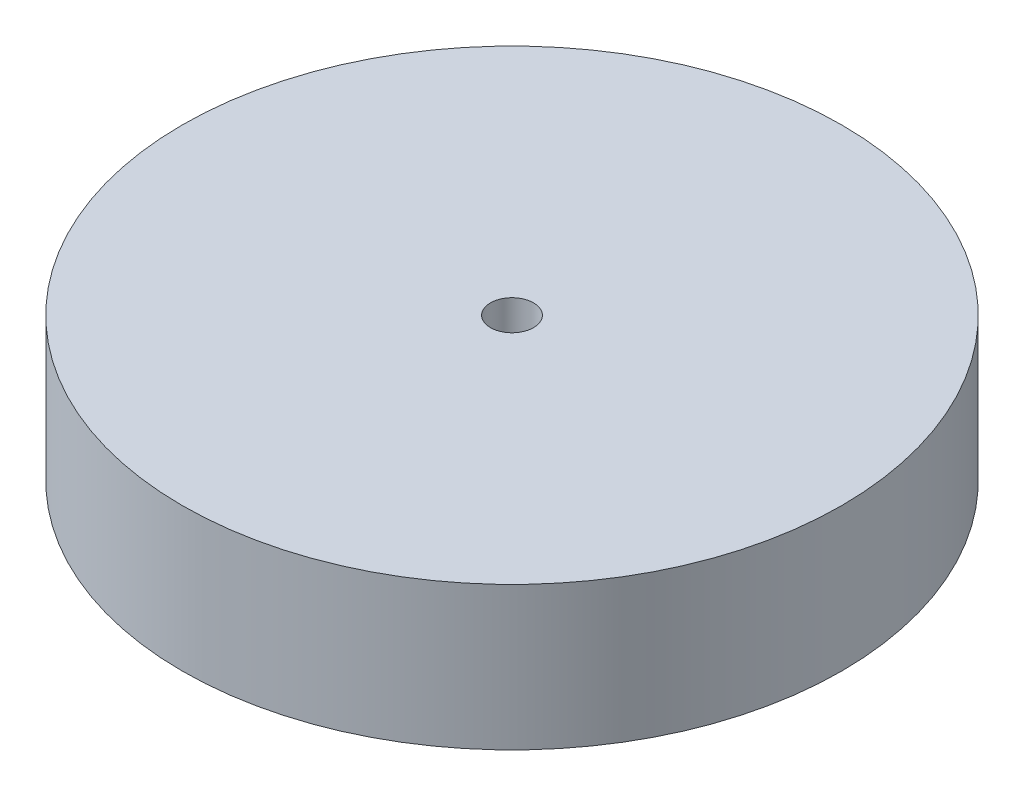
ISO-10303-21;
HEADER;
FILE_DESCRIPTION(('STEP AP214'),'2;1');
FILE_NAME('part.step','',(''),(''),'','','');
FILE_SCHEMA(('AUTOMOTIVE_DESIGN { 1 0 10303 214 1 1 1 1 }'));
ENDSEC;
DATA;
#1=APPLICATION_CONTEXT('core data for automotive mechanical design processes');
#2=APPLICATION_PROTOCOL_DEFINITION('international standard','automotive_design',2000,#1);
#3=PRODUCT_CONTEXT('',#1,'mechanical');
#4=PRODUCT('Part','Part','',(#3));
#5=PRODUCT_RELATED_PRODUCT_CATEGORY('part','',(#4));
#6=PRODUCT_DEFINITION_FORMATION('','',#4);
#7=PRODUCT_DEFINITION_CONTEXT('part definition',#1,'design');
#8=PRODUCT_DEFINITION('design','',#6,#7);
#9=PRODUCT_DEFINITION_SHAPE('','',#8);
#10=(LENGTH_UNIT() NAMED_UNIT(*) SI_UNIT(.MILLI.,.METRE.));
#11=(NAMED_UNIT(*) PLANE_ANGLE_UNIT() SI_UNIT($,.RADIAN.));
#12=(NAMED_UNIT(*) SI_UNIT($,.STERADIAN.) SOLID_ANGLE_UNIT());
#13=UNCERTAINTY_MEASURE_WITH_UNIT(LENGTH_MEASURE(1.E-05),#10,'distance_accuracy_value','');
#14=(GEOMETRIC_REPRESENTATION_CONTEXT(3) GLOBAL_UNCERTAINTY_ASSIGNED_CONTEXT((#13)) GLOBAL_UNIT_ASSIGNED_CONTEXT((#10,
#11,#12)) REPRESENTATION_CONTEXT('',''));
#15=CARTESIAN_POINT('',(0.,0.,0.));
#16=DIRECTION('',(0.,0.,1.));
#17=DIRECTION('',(1.,0.,0.));
#18=AXIS2_PLACEMENT_3D('',#15,#16,#17);
#19=CARTESIAN_POINT('',(0.,10.,0.));
#20=DIRECTION('',(0.,-1.,0.));
#21=DIRECTION('',(0.,0.,-1.));
#22=AXIS2_PLACEMENT_3D('',#19,#20,#21);
#23=CYLINDRICAL_SURFACE('',#22,23.);
#24=CARTESIAN_POINT('',(0.,10.,0.));
#25=DIRECTION('',(0.,1.,0.));
#26=DIRECTION('',(0.,0.,1.));
#27=AXIS2_PLACEMENT_3D('',#24,#25,#26);
#28=CIRCLE('',#27,23.);
#29=CARTESIAN_POINT('',(0.,10.,23.));
#30=VERTEX_POINT('',#29);
#31=EDGE_CURVE('E10',#30,#30,#28,.T.);
#32=ORIENTED_EDGE('',*,*,#31,.F.);
#33=EDGE_LOOP('',(#32));
#34=FACE_BOUND('',#33,.T.);
#35=CARTESIAN_POINT('',(0.,0.,0.));
#36=DIRECTION('',(0.,1.,0.));
#37=DIRECTION('',(0.,0.,1.));
#38=AXIS2_PLACEMENT_3D('',#35,#36,#37);
#39=CIRCLE('',#38,23.);
#40=CARTESIAN_POINT('',(0.,0.,23.));
#41=VERTEX_POINT('',#40);
#42=EDGE_CURVE('E42',#41,#41,#39,.T.);
#43=ORIENTED_EDGE('',*,*,#42,.T.);
#44=EDGE_LOOP('',(#43));
#45=FACE_BOUND('',#44,.T.);
#46=ADVANCED_FACE('F39',(#34,#45),#23,.T.);
#47=CARTESIAN_POINT('',(0.,10.,0.));
#48=DIRECTION('',(0.,1.,0.));
#49=DIRECTION('',(0.,0.,1.));
#50=AXIS2_PLACEMENT_3D('',#47,#48,#49);
#51=PLANE('',#50);
#52=CARTESIAN_POINT('',(0.,10.,0.));
#53=DIRECTION('',(0.,1.,0.));
#54=DIRECTION('',(0.,0.,1.));
#55=AXIS2_PLACEMENT_3D('',#52,#53,#54);
#56=CIRCLE('',#55,1.5);
#57=CARTESIAN_POINT('',(0.,10.,1.5));
#58=VERTEX_POINT('',#57);
#59=EDGE_CURVE('E60',#58,#58,#56,.F.);
#60=ORIENTED_EDGE('',*,*,#59,.T.);
#61=EDGE_LOOP('',(#60));
#62=FACE_BOUND('',#61,.T.);
#63=ORIENTED_EDGE('',*,*,#31,.T.);
#64=EDGE_LOOP('',(#63));
#65=FACE_BOUND('',#64,.T.);
#66=ADVANCED_FACE('F99',(#62,#65),#51,.T.);
#67=CARTESIAN_POINT('',(0.,0.,0.));
#68=DIRECTION('',(0.,1.,0.));
#69=DIRECTION('',(0.,0.,1.));
#70=AXIS2_PLACEMENT_3D('',#67,#68,#69);
#71=PLANE('',#70);
#72=CARTESIAN_POINT('',(0.,0.,0.));
#73=DIRECTION('',(0.,-1.,0.));
#74=DIRECTION('',(0.,0.,-1.));
#75=AXIS2_PLACEMENT_3D('',#72,#73,#74);
#76=CIRCLE('',#75,20.);
#77=CARTESIAN_POINT('',(0.,0.,-20.));
#78=VERTEX_POINT('',#77);
#79=EDGE_CURVE('E51',#78,#78,#76,.T.);
#80=ORIENTED_EDGE('',*,*,#79,.F.);
#81=EDGE_LOOP('',(#80));
#82=FACE_BOUND('',#81,.T.);
#83=ORIENTED_EDGE('',*,*,#42,.F.);
#84=EDGE_LOOP('',(#83));
#85=FACE_BOUND('',#84,.T.);
#86=ADVANCED_FACE('F93',(#82,#85),#71,.F.);
#87=CARTESIAN_POINT('',(0.,7.3,0.));
#88=DIRECTION('',(0.,-1.,0.));
#89=DIRECTION('',(0.,0.,-1.));
#90=AXIS2_PLACEMENT_3D('',#87,#88,#89);
#91=CYLINDRICAL_SURFACE('',#90,20.);
#92=CARTESIAN_POINT('',(0.,7.3,0.));
#93=DIRECTION('',(0.,-1.,0.));
#94=DIRECTION('',(0.,0.,-1.));
#95=AXIS2_PLACEMENT_3D('',#92,#93,#94);
#96=CIRCLE('',#95,20.);
#97=CARTESIAN_POINT('',(0.,7.3,-20.));
#98=VERTEX_POINT('',#97);
#99=EDGE_CURVE('E49',#98,#98,#96,.T.);
#100=ORIENTED_EDGE('',*,*,#99,.F.);
#101=EDGE_LOOP('',(#100));
#102=FACE_BOUND('',#101,.T.);
#103=ORIENTED_EDGE('',*,*,#79,.T.);
#104=EDGE_LOOP('',(#103));
#105=FACE_BOUND('',#104,.T.);
#106=ADVANCED_FACE('F87',(#102,#105),#91,.F.);
#107=CARTESIAN_POINT('',(0.,7.3,0.));
#108=DIRECTION('',(0.,-1.,0.));
#109=DIRECTION('',(0.,0.,-1.));
#110=AXIS2_PLACEMENT_3D('',#107,#108,#109);
#111=PLANE('',#110);
#112=CARTESIAN_POINT('',(0.,7.3,0.));
#113=DIRECTION('',(0.,-1.,0.));
#114=DIRECTION('',(0.,0.,-1.));
#115=AXIS2_PLACEMENT_3D('',#112,#113,#114);
#116=CIRCLE('',#115,6.);
#117=CARTESIAN_POINT('',(0.,7.3,6.));
#118=VERTEX_POINT('',#117);
#119=EDGE_CURVE('E57',#118,#118,#116,.T.);
#120=ORIENTED_EDGE('',*,*,#119,.F.);
#121=EDGE_LOOP('',(#120));
#122=FACE_BOUND('',#121,.T.);
#123=ORIENTED_EDGE('',*,*,#99,.T.);
#124=EDGE_LOOP('',(#123));
#125=FACE_BOUND('',#124,.T.);
#126=ADVANCED_FACE('F81',(#122,#125),#111,.T.);
#127=CARTESIAN_POINT('',(0.,-7.2,0.));
#128=DIRECTION('',(0.,1.,0.));
#129=DIRECTION('',(0.,0.,1.));
#130=AXIS2_PLACEMENT_3D('',#127,#128,#129);
#131=CYLINDRICAL_SURFACE('',#130,6.);
#132=CARTESIAN_POINT('',(0.,-7.2,0.));
#133=DIRECTION('',(0.,-1.,0.));
#134=DIRECTION('',(0.,0.,-1.));
#135=AXIS2_PLACEMENT_3D('',#132,#133,#134);
#136=CIRCLE('',#135,6.);
#137=CARTESIAN_POINT('',(0.,-7.2,6.));
#138=VERTEX_POINT('',#137);
#139=EDGE_CURVE('E54',#138,#138,#136,.T.);
#140=CARTESIAN_POINT('',(0.,-7.2,6.));
#141=CARTESIAN_POINT('',(0.,-7.04895833333333,6.));
#142=CARTESIAN_POINT('',(0.,-6.89791666666667,6.));
#143=CARTESIAN_POINT('',(0.,-6.59583333333333,6.));
#144=CARTESIAN_POINT('',(0.,-6.44479166666667,6.));
#145=CARTESIAN_POINT('',(0.,-6.14270833333333,6.));
#146=CARTESIAN_POINT('',(0.,-5.99166666666667,6.));
#147=CARTESIAN_POINT('',(0.,-5.68958333333333,6.));
#148=CARTESIAN_POINT('',(0.,-5.53854166666667,6.));
#149=CARTESIAN_POINT('',(0.,-5.23645833333333,6.));
#150=CARTESIAN_POINT('',(0.,-5.08541666666667,6.));
#151=CARTESIAN_POINT('',(0.,-4.78333333333333,6.));
#152=CARTESIAN_POINT('',(0.,-4.63229166666667,6.));
#153=CARTESIAN_POINT('',(0.,-4.33020833333333,6.));
#154=CARTESIAN_POINT('',(0.,-4.17916666666667,6.));
#155=CARTESIAN_POINT('',(0.,-3.87708333333333,6.));
#156=CARTESIAN_POINT('',(0.,-3.72604166666667,6.));
#157=CARTESIAN_POINT('',(0.,-3.42395833333333,6.));
#158=CARTESIAN_POINT('',(0.,-3.27291666666667,6.));
#159=CARTESIAN_POINT('',(0.,-2.97083333333333,6.));
#160=CARTESIAN_POINT('',(0.,-2.81979166666667,6.));
#161=CARTESIAN_POINT('',(0.,-2.51770833333333,6.));
#162=CARTESIAN_POINT('',(0.,-2.36666666666667,6.));
#163=CARTESIAN_POINT('',(0.,-2.06458333333333,6.));
#164=CARTESIAN_POINT('',(0.,-1.91354166666667,6.));
#165=CARTESIAN_POINT('',(0.,-1.61145833333333,6.));
#166=CARTESIAN_POINT('',(0.,-1.46041666666667,6.));
#167=CARTESIAN_POINT('',(0.,-1.15833333333333,6.));
#168=CARTESIAN_POINT('',(0.,-1.00729166666667,6.));
#169=CARTESIAN_POINT('',(0.,-0.705208333333333,6.));
#170=CARTESIAN_POINT('',(0.,-0.554166666666666,6.));
#171=CARTESIAN_POINT('',(0.,-0.252083333333333,6.));
#172=CARTESIAN_POINT('',(0.,-0.101041666666666,6.));
#173=CARTESIAN_POINT('',(0.,0.201041666666667,6.));
#174=CARTESIAN_POINT('',(0.,0.352083333333334,6.));
#175=CARTESIAN_POINT('',(0.,0.654166666666667,6.));
#176=CARTESIAN_POINT('',(0.,0.805208333333333,6.));
#177=CARTESIAN_POINT('',(0.,1.10729166666667,6.));
#178=CARTESIAN_POINT('',(0.,1.25833333333333,6.));
#179=CARTESIAN_POINT('',(0.,1.56041666666667,6.));
#180=CARTESIAN_POINT('',(0.,1.71145833333333,6.));
#181=CARTESIAN_POINT('',(0.,2.01354166666667,6.));
#182=CARTESIAN_POINT('',(0.,2.16458333333333,6.));
#183=CARTESIAN_POINT('',(0.,2.46666666666667,6.));
#184=CARTESIAN_POINT('',(0.,2.61770833333333,6.));
#185=CARTESIAN_POINT('',(0.,2.91979166666667,6.));
#186=CARTESIAN_POINT('',(0.,3.07083333333333,6.));
#187=CARTESIAN_POINT('',(0.,3.37291666666667,6.));
#188=CARTESIAN_POINT('',(0.,3.52395833333333,6.));
#189=CARTESIAN_POINT('',(0.,3.82604166666667,6.));
#190=CARTESIAN_POINT('',(0.,3.97708333333333,6.));
#191=CARTESIAN_POINT('',(0.,4.27916666666667,6.));
#192=CARTESIAN_POINT('',(0.,4.43020833333333,6.));
#193=CARTESIAN_POINT('',(0.,4.73229166666667,6.));
#194=CARTESIAN_POINT('',(0.,4.88333333333333,6.));
#195=CARTESIAN_POINT('',(0.,5.18541666666667,6.));
#196=CARTESIAN_POINT('',(0.,5.33645833333333,6.));
#197=CARTESIAN_POINT('',(0.,5.63854166666667,6.));
#198=CARTESIAN_POINT('',(0.,5.78958333333333,6.));
#199=CARTESIAN_POINT('',(0.,6.09166666666667,6.));
#200=CARTESIAN_POINT('',(0.,6.24270833333333,6.));
#201=CARTESIAN_POINT('',(0.,6.54479166666667,6.));
#202=CARTESIAN_POINT('',(0.,6.69583333333333,6.));
#203=CARTESIAN_POINT('',(0.,6.99791666666667,6.));
#204=CARTESIAN_POINT('',(0.,7.14895833333333,6.));
#205=CARTESIAN_POINT('',(0.,7.3,6.));
#206=B_SPLINE_CURVE_WITH_KNOTS('',3,(#140,#141,#142,#143,#144,#145,#146,#147,#148,#149,#150,
#151,#152,#153,#154,#155,#156,#157,#158,#159,#160,#161,#162,#163,#164,#165,#166,#167,#168,#169,
#170,#171,#172,#173,#174,#175,#176,#177,#178,#179,#180,#181,#182,#183,#184,#185,#186,#187,#188,
#189,#190,#191,#192,#193,#194,#195,#196,#197,#198,#199,#200,#201,#202,#203,#204,#205),
.UNSPECIFIED.,.F.,.F.,(4,2,2,2,2,2,2,2,2,2,2,2,2,2,2,2,2,2,2,2,2,2,2,2,2,2,2,2,2,2,2,2,4),(0.,
0.453125,0.90625,1.359375,1.8125,2.265625,2.71875,3.171875,3.625,4.078125,4.53125,4.984375,
5.4375,5.890625,6.34375,6.796875,7.25,7.703125,8.15625,8.609375,9.0625,9.515625,9.96875,
10.421875,10.875,11.328125,11.78125,12.234375,12.6875,13.140625,13.59375,14.046875,14.5),.UNSPECIFIED.);
#207=EDGE_CURVE('BSEAM75',#138,#118,#206,.T.);
#208=ORIENTED_EDGE('',*,*,#139,.F.);
#209=ORIENTED_EDGE('',*,*,#119,.T.);
#210=ORIENTED_EDGE('',*,*,#207,.T.);
#211=ORIENTED_EDGE('',*,*,#207,.F.);
#212=EDGE_LOOP('',(#208,#210,#209,#211));
#213=FACE_BOUND('',#212,.T.);
#214=ADVANCED_FACE('F75',(#213),#131,.T.);
#215=CARTESIAN_POINT('',(0.,-7.2,0.));
#216=DIRECTION('',(0.,-1.,0.));
#217=DIRECTION('',(0.,0.,-1.));
#218=AXIS2_PLACEMENT_3D('',#215,#216,#217);
#219=PLANE('',#218);
#220=CARTESIAN_POINT('',(0.,-7.2,0.));
#221=DIRECTION('',(0.,-1.,0.));
#222=DIRECTION('',(0.,0.,-1.));
#223=AXIS2_PLACEMENT_3D('',#220,#221,#222);
#224=CIRCLE('',#223,1.5);
#225=CARTESIAN_POINT('',(0.,-7.2,-1.5));
#226=VERTEX_POINT('',#225);
#227=EDGE_CURVE('E65',#226,#226,#224,.T.);
#228=ORIENTED_EDGE('',*,*,#227,.F.);
#229=EDGE_LOOP('',(#228));
#230=FACE_BOUND('',#229,.T.);
#231=ORIENTED_EDGE('',*,*,#139,.T.);
#232=EDGE_LOOP('',(#231));
#233=FACE_BOUND('',#232,.T.);
#234=ADVANCED_FACE('F72',(#230,#233),#219,.T.);
#235=CARTESIAN_POINT('',(0.,14.2426406871193,0.));
#236=DIRECTION('',(0.,-1.,0.));
#237=DIRECTION('',(0.,0.,-1.));
#238=AXIS2_PLACEMENT_3D('',#235,#236,#237);
#239=CYLINDRICAL_SURFACE('',#238,1.5);
#240=ORIENTED_EDGE('',*,*,#227,.T.);
#241=EDGE_LOOP('',(#240));
#242=FACE_BOUND('',#241,.T.);
#243=ORIENTED_EDGE('',*,*,#59,.F.);
#244=EDGE_LOOP('',(#243));
#245=FACE_BOUND('',#244,.T.);
#246=ADVANCED_FACE('F69',(#242,#245),#239,.F.);
#247=CLOSED_SHELL('',(#46,#66,#86,#106,#126,#214,#234,#246));
#248=MANIFOLD_SOLID_BREP('B2',#247);
#249=ADVANCED_BREP_SHAPE_REPRESENTATION('',(#18,#248),#14);
#250=SHAPE_DEFINITION_REPRESENTATION(#9,#249);
ENDSEC;
END-ISO-10303-21;
